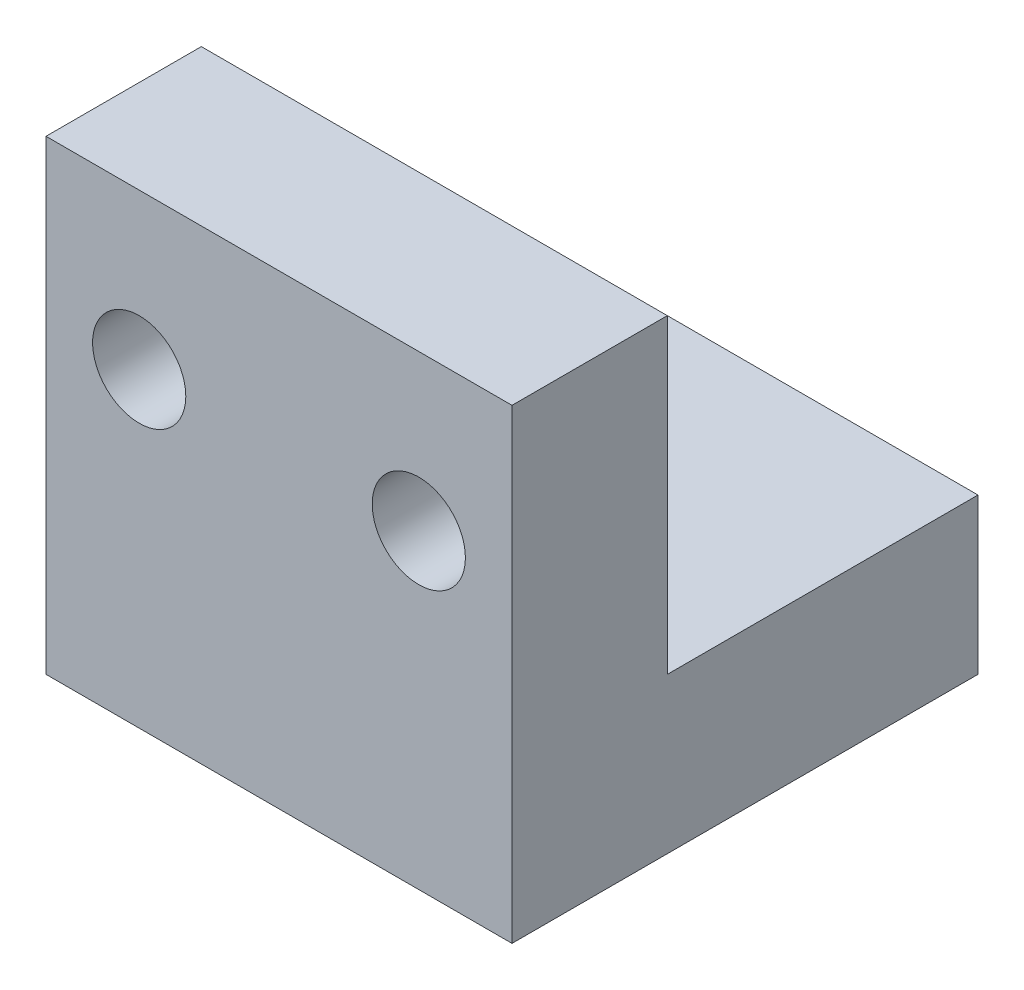
ISO-10303-21;
HEADER;
FILE_DESCRIPTION(('STEP AP214'),'2;1');
FILE_NAME('part.step','',(''),(''),'','','');
FILE_SCHEMA(('AUTOMOTIVE_DESIGN { 1 0 10303 214 1 1 1 1 }'));
ENDSEC;
DATA;
#1=APPLICATION_CONTEXT('core data for automotive mechanical design processes');
#2=APPLICATION_PROTOCOL_DEFINITION('international standard','automotive_design',2000,#1);
#3=PRODUCT_CONTEXT('',#1,'mechanical');
#4=PRODUCT('Part','Part','',(#3));
#5=PRODUCT_RELATED_PRODUCT_CATEGORY('part','',(#4));
#6=PRODUCT_DEFINITION_FORMATION('','',#4);
#7=PRODUCT_DEFINITION_CONTEXT('part definition',#1,'design');
#8=PRODUCT_DEFINITION('design','',#6,#7);
#9=PRODUCT_DEFINITION_SHAPE('','',#8);
#10=(LENGTH_UNIT() NAMED_UNIT(*) SI_UNIT(.MILLI.,.METRE.));
#11=(NAMED_UNIT(*) PLANE_ANGLE_UNIT() SI_UNIT($,.RADIAN.));
#12=(NAMED_UNIT(*) SI_UNIT($,.STERADIAN.) SOLID_ANGLE_UNIT());
#13=UNCERTAINTY_MEASURE_WITH_UNIT(LENGTH_MEASURE(1.E-05),#10,'distance_accuracy_value','');
#14=(GEOMETRIC_REPRESENTATION_CONTEXT(3) GLOBAL_UNCERTAINTY_ASSIGNED_CONTEXT((#13)) GLOBAL_UNIT_ASSIGNED_CONTEXT((#10,
#11,#12)) REPRESENTATION_CONTEXT('',''));
#15=CARTESIAN_POINT('',(0.,0.,0.));
#16=DIRECTION('',(0.,0.,1.));
#17=DIRECTION('',(1.,0.,0.));
#18=AXIS2_PLACEMENT_3D('',#15,#16,#17);
#19=CARTESIAN_POINT('',(0.,5.,0.));
#20=DIRECTION('',(0.,-1.,0.));
#21=DIRECTION('',(0.,0.,-1.));
#22=AXIS2_PLACEMENT_3D('',#19,#20,#21);
#23=PLANE('',#22);
#24=DIRECTION('',(0.,0.,1.));
#25=VECTOR('',#24,1.);
#26=CARTESIAN_POINT('',(0.,5.,0.));
#27=LINE('',#26,#25);
#28=CARTESIAN_POINT('',(0.,5.,-15.));
#29=VERTEX_POINT('',#28);
#30=CARTESIAN_POINT('',(0.,5.,-5.));
#31=VERTEX_POINT('',#30);
#32=EDGE_CURVE('E97',#29,#31,#27,.T.);
#33=ORIENTED_EDGE('',*,*,#32,.T.);
#34=DIRECTION('',(1.,0.,0.));
#35=VECTOR('',#34,1.);
#36=CARTESIAN_POINT('',(0.,5.,-5.));
#37=LINE('',#36,#35);
#38=CARTESIAN_POINT('',(15.,5.,-5.));
#39=VERTEX_POINT('',#38);
#40=EDGE_CURVE('E11',#31,#39,#37,.T.);
#41=ORIENTED_EDGE('',*,*,#40,.T.);
#42=DIRECTION('',(0.,0.,-1.));
#43=VECTOR('',#42,1.);
#44=CARTESIAN_POINT('',(15.,5.,0.));
#45=LINE('',#44,#43);
#46=CARTESIAN_POINT('',(15.,5.,-15.));
#47=VERTEX_POINT('',#46);
#48=EDGE_CURVE('E170',#39,#47,#45,.T.);
#49=ORIENTED_EDGE('',*,*,#48,.T.);
#50=DIRECTION('',(-1.,0.,0.));
#51=VECTOR('',#50,1.);
#52=CARTESIAN_POINT('',(0.,5.,-15.));
#53=LINE('',#52,#51);
#54=EDGE_CURVE('E68',#47,#29,#53,.T.);
#55=ORIENTED_EDGE('',*,*,#54,.T.);
#56=EDGE_LOOP('',(#33,#41,#49,#55));
#57=FACE_BOUND('',#56,.T.);
#58=CARTESIAN_POINT('',(7.5,5.,-10.));
#59=DIRECTION('',(0.,1.,0.));
#60=DIRECTION('',(0.,0.,1.));
#61=AXIS2_PLACEMENT_3D('',#58,#59,#60);
#62=CIRCLE('',#61,1.5);
#63=CARTESIAN_POINT('',(7.5,5.,-8.5));
#64=VERTEX_POINT('',#63);
#65=EDGE_CURVE('E111',#64,#64,#62,.T.);
#66=ORIENTED_EDGE('',*,*,#65,.F.);
#67=EDGE_LOOP('',(#66));
#68=FACE_BOUND('',#67,.T.);
#69=ADVANCED_FACE('F44',(#57,#68),#23,.F.);
#70=CARTESIAN_POINT('',(0.,0.,0.));
#71=DIRECTION('',(0.,-1.,0.));
#72=DIRECTION('',(0.,0.,-1.));
#73=AXIS2_PLACEMENT_3D('',#70,#71,#72);
#74=PLANE('',#73);
#75=DIRECTION('',(-1.,0.,0.));
#76=VECTOR('',#75,1.);
#77=CARTESIAN_POINT('',(0.,0.,-15.));
#78=LINE('',#77,#76);
#79=CARTESIAN_POINT('',(15.,0.,-15.));
#80=VERTEX_POINT('',#79);
#81=CARTESIAN_POINT('',(0.,0.,-15.));
#82=VERTEX_POINT('',#81);
#83=EDGE_CURVE('E86',#80,#82,#78,.T.);
#84=ORIENTED_EDGE('',*,*,#83,.F.);
#85=DIRECTION('',(0.,0.,-1.));
#86=VECTOR('',#85,1.);
#87=CARTESIAN_POINT('',(15.,0.,0.));
#88=LINE('',#87,#86);
#89=CARTESIAN_POINT('',(15.,0.,0.));
#90=VERTEX_POINT('',#89);
#91=EDGE_CURVE('E99',#90,#80,#88,.T.);
#92=ORIENTED_EDGE('',*,*,#91,.F.);
#93=DIRECTION('',(1.,0.,0.));
#94=VECTOR('',#93,1.);
#95=CARTESIAN_POINT('',(0.,0.,0.));
#96=LINE('',#95,#94);
#97=CARTESIAN_POINT('',(0.,0.,0.));
#98=VERTEX_POINT('',#97);
#99=EDGE_CURVE('E112',#98,#90,#96,.T.);
#100=ORIENTED_EDGE('',*,*,#99,.F.);
#101=DIRECTION('',(0.,0.,1.));
#102=VECTOR('',#101,1.);
#103=CARTESIAN_POINT('',(0.,0.,0.));
#104=LINE('',#103,#102);
#105=EDGE_CURVE('E102',#82,#98,#104,.T.);
#106=ORIENTED_EDGE('',*,*,#105,.F.);
#107=EDGE_LOOP('',(#84,#92,#100,#106));
#108=FACE_BOUND('',#107,.T.);
#109=CARTESIAN_POINT('',(7.5,0.,-10.));
#110=DIRECTION('',(0.,1.,0.));
#111=DIRECTION('',(0.,0.,1.));
#112=AXIS2_PLACEMENT_3D('',#109,#110,#111);
#113=CIRCLE('',#112,1.5);
#114=CARTESIAN_POINT('',(7.5,0.,-8.5));
#115=VERTEX_POINT('',#114);
#116=EDGE_CURVE('E118',#115,#115,#113,.T.);
#117=ORIENTED_EDGE('',*,*,#116,.T.);
#118=EDGE_LOOP('',(#117));
#119=FACE_BOUND('',#118,.T.);
#120=ADVANCED_FACE('F108',(#108,#119),#74,.T.);
#121=CARTESIAN_POINT('',(0.,5.,0.));
#122=DIRECTION('',(1.,0.,0.));
#123=DIRECTION('',(0.,0.,-1.));
#124=AXIS2_PLACEMENT_3D('',#121,#122,#123);
#125=PLANE('',#124);
#126=DIRECTION('',(0.,-1.,0.));
#127=VECTOR('',#126,1.);
#128=CARTESIAN_POINT('',(0.,5.,0.));
#129=LINE('',#128,#127);
#130=CARTESIAN_POINT('',(0.,15.,0.));
#131=VERTEX_POINT('',#130);
#132=EDGE_CURVE('E53',#131,#98,#129,.T.);
#133=ORIENTED_EDGE('',*,*,#132,.F.);
#134=DIRECTION('',(0.,0.,1.));
#135=VECTOR('',#134,1.);
#136=CARTESIAN_POINT('',(0.,15.,-5.));
#137=LINE('',#136,#135);
#138=CARTESIAN_POINT('',(0.,15.,-5.));
#139=VERTEX_POINT('',#138);
#140=EDGE_CURVE('E145',#139,#131,#137,.T.);
#141=ORIENTED_EDGE('',*,*,#140,.F.);
#142=DIRECTION('',(0.,-1.,0.));
#143=VECTOR('',#142,1.);
#144=CARTESIAN_POINT('',(0.,0.,-5.));
#145=LINE('',#144,#143);
#146=EDGE_CURVE('E179',#139,#31,#145,.T.);
#147=ORIENTED_EDGE('',*,*,#146,.T.);
#148=ORIENTED_EDGE('',*,*,#32,.F.);
#149=DIRECTION('',(0.,-1.,0.));
#150=VECTOR('',#149,1.);
#151=CARTESIAN_POINT('',(0.,5.,-15.));
#152=LINE('',#151,#150);
#153=EDGE_CURVE('E93',#29,#82,#152,.T.);
#154=ORIENTED_EDGE('',*,*,#153,.T.);
#155=ORIENTED_EDGE('',*,*,#105,.T.);
#156=EDGE_LOOP('',(#133,#141,#147,#148,#154,#155));
#157=FACE_BOUND('',#156,.T.);
#158=ADVANCED_FACE('F50',(#157),#125,.F.);
#159=CARTESIAN_POINT('',(0.,5.,0.));
#160=DIRECTION('',(0.,0.,-1.));
#161=DIRECTION('',(-1.,0.,0.));
#162=AXIS2_PLACEMENT_3D('',#159,#160,#161);
#163=PLANE('',#162);
#164=ORIENTED_EDGE('',*,*,#99,.T.);
#165=DIRECTION('',(0.,-1.,0.));
#166=VECTOR('',#165,1.);
#167=CARTESIAN_POINT('',(15.,5.,0.));
#168=LINE('',#167,#166);
#169=CARTESIAN_POINT('',(15.,15.,0.));
#170=VERTEX_POINT('',#169);
#171=EDGE_CURVE('E129',#170,#90,#168,.T.);
#172=ORIENTED_EDGE('',*,*,#171,.F.);
#173=DIRECTION('',(-1.,0.,0.));
#174=VECTOR('',#173,1.);
#175=CARTESIAN_POINT('',(0.,15.,0.));
#176=LINE('',#175,#174);
#177=EDGE_CURVE('E140',#170,#131,#176,.T.);
#178=ORIENTED_EDGE('',*,*,#177,.T.);
#179=ORIENTED_EDGE('',*,*,#132,.T.);
#180=EDGE_LOOP('',(#164,#172,#178,#179));
#181=FACE_BOUND('',#180,.T.);
#182=CARTESIAN_POINT('',(12.,10.,0.));
#183=DIRECTION('',(0.,0.,1.));
#184=DIRECTION('',(1.,0.,0.));
#185=AXIS2_PLACEMENT_3D('',#182,#183,#184);
#186=CIRCLE('',#185,1.5);
#187=CARTESIAN_POINT('',(13.5,10.,0.));
#188=VERTEX_POINT('',#187);
#189=EDGE_CURVE('E193',#188,#188,#186,.T.);
#190=ORIENTED_EDGE('',*,*,#189,.F.);
#191=EDGE_LOOP('',(#190));
#192=FACE_BOUND('',#191,.T.);
#193=CARTESIAN_POINT('',(3.,10.,0.));
#194=DIRECTION('',(0.,0.,1.));
#195=DIRECTION('',(1.,0.,0.));
#196=AXIS2_PLACEMENT_3D('',#193,#194,#195);
#197=CIRCLE('',#196,1.5);
#198=CARTESIAN_POINT('',(4.5,10.,0.));
#199=VERTEX_POINT('',#198);
#200=EDGE_CURVE('E183',#199,#199,#197,.T.);
#201=ORIENTED_EDGE('',*,*,#200,.F.);
#202=EDGE_LOOP('',(#201));
#203=FACE_BOUND('',#202,.T.);
#204=ADVANCED_FACE('F133',(#181,#192,#203),#163,.F.);
#205=CARTESIAN_POINT('',(15.,5.,0.));
#206=DIRECTION('',(-1.,0.,0.));
#207=DIRECTION('',(0.,0.,1.));
#208=AXIS2_PLACEMENT_3D('',#205,#206,#207);
#209=PLANE('',#208);
#210=ORIENTED_EDGE('',*,*,#91,.T.);
#211=DIRECTION('',(0.,-1.,0.));
#212=VECTOR('',#211,1.);
#213=CARTESIAN_POINT('',(15.,5.,-15.));
#214=LINE('',#213,#212);
#215=EDGE_CURVE('E94',#47,#80,#214,.T.);
#216=ORIENTED_EDGE('',*,*,#215,.F.);
#217=ORIENTED_EDGE('',*,*,#48,.F.);
#218=DIRECTION('',(0.,1.,0.));
#219=VECTOR('',#218,1.);
#220=CARTESIAN_POINT('',(15.,0.,-5.));
#221=LINE('',#220,#219);
#222=CARTESIAN_POINT('',(15.,15.,-5.));
#223=VERTEX_POINT('',#222);
#224=EDGE_CURVE('E62',#39,#223,#221,.T.);
#225=ORIENTED_EDGE('',*,*,#224,.T.);
#226=DIRECTION('',(0.,0.,1.));
#227=VECTOR('',#226,1.);
#228=CARTESIAN_POINT('',(15.,15.,-5.));
#229=LINE('',#228,#227);
#230=EDGE_CURVE('E154',#223,#170,#229,.T.);
#231=ORIENTED_EDGE('',*,*,#230,.T.);
#232=ORIENTED_EDGE('',*,*,#171,.T.);
#233=EDGE_LOOP('',(#210,#216,#217,#225,#231,#232));
#234=FACE_BOUND('',#233,.T.);
#235=ADVANCED_FACE('F174',(#234),#209,.F.);
#236=CARTESIAN_POINT('',(0.,5.,-15.));
#237=DIRECTION('',(0.,0.,1.));
#238=DIRECTION('',(1.,0.,0.));
#239=AXIS2_PLACEMENT_3D('',#236,#237,#238);
#240=PLANE('',#239);
#241=ORIENTED_EDGE('',*,*,#83,.T.);
#242=ORIENTED_EDGE('',*,*,#153,.F.);
#243=ORIENTED_EDGE('',*,*,#54,.F.);
#244=ORIENTED_EDGE('',*,*,#215,.T.);
#245=EDGE_LOOP('',(#241,#242,#243,#244));
#246=FACE_BOUND('',#245,.T.);
#247=ADVANCED_FACE('F89',(#246),#240,.F.);
#248=CARTESIAN_POINT('',(7.5,5.,-10.));
#249=DIRECTION('',(0.,-1.,0.));
#250=DIRECTION('',(0.,0.,-1.));
#251=AXIS2_PLACEMENT_3D('',#248,#249,#250);
#252=CYLINDRICAL_SURFACE('',#251,1.5);
#253=ORIENTED_EDGE('',*,*,#65,.T.);
#254=EDGE_LOOP('',(#253));
#255=FACE_BOUND('',#254,.T.);
#256=ORIENTED_EDGE('',*,*,#116,.F.);
#257=EDGE_LOOP('',(#256));
#258=FACE_BOUND('',#257,.T.);
#259=ADVANCED_FACE('F228',(#255,#258),#252,.F.);
#260=CARTESIAN_POINT('',(0.,0.,-5.));
#261=DIRECTION('',(0.,0.,-1.));
#262=DIRECTION('',(-1.,0.,0.));
#263=AXIS2_PLACEMENT_3D('',#260,#261,#262);
#264=PLANE('',#263);
#265=CARTESIAN_POINT('',(3.,10.,-5.));
#266=DIRECTION('',(0.,0.,1.));
#267=DIRECTION('',(1.,0.,0.));
#268=AXIS2_PLACEMENT_3D('',#265,#266,#267);
#269=CIRCLE('',#268,1.5);
#270=CARTESIAN_POINT('',(4.5,10.,-5.));
#271=VERTEX_POINT('',#270);
#272=EDGE_CURVE('E186',#271,#271,#269,.T.);
#273=ORIENTED_EDGE('',*,*,#272,.T.);
#274=EDGE_LOOP('',(#273));
#275=FACE_BOUND('',#274,.T.);
#276=CARTESIAN_POINT('',(12.,10.,-5.));
#277=DIRECTION('',(0.,0.,1.));
#278=DIRECTION('',(1.,0.,0.));
#279=AXIS2_PLACEMENT_3D('',#276,#277,#278);
#280=CIRCLE('',#279,1.5);
#281=CARTESIAN_POINT('',(13.5,10.,-5.));
#282=VERTEX_POINT('',#281);
#283=EDGE_CURVE('E188',#282,#282,#280,.T.);
#284=ORIENTED_EDGE('',*,*,#283,.T.);
#285=EDGE_LOOP('',(#284));
#286=FACE_BOUND('',#285,.T.);
#287=ORIENTED_EDGE('',*,*,#40,.F.);
#288=ORIENTED_EDGE('',*,*,#146,.F.);
#289=DIRECTION('',(-1.,0.,0.));
#290=VECTOR('',#289,1.);
#291=CARTESIAN_POINT('',(0.,15.,-5.));
#292=LINE('',#291,#290);
#293=EDGE_CURVE('E153',#223,#139,#292,.T.);
#294=ORIENTED_EDGE('',*,*,#293,.F.);
#295=ORIENTED_EDGE('',*,*,#224,.F.);
#296=EDGE_LOOP('',(#287,#288,#294,#295));
#297=FACE_BOUND('',#296,.T.);
#298=ADVANCED_FACE('F180',(#275,#286,#297),#264,.T.);
#299=CARTESIAN_POINT('',(0.,15.,-5.));
#300=DIRECTION('',(0.,1.,0.));
#301=DIRECTION('',(0.,0.,1.));
#302=AXIS2_PLACEMENT_3D('',#299,#300,#301);
#303=PLANE('',#302);
#304=ORIENTED_EDGE('',*,*,#177,.F.);
#305=ORIENTED_EDGE('',*,*,#230,.F.);
#306=ORIENTED_EDGE('',*,*,#293,.T.);
#307=ORIENTED_EDGE('',*,*,#140,.T.);
#308=EDGE_LOOP('',(#304,#305,#306,#307));
#309=FACE_BOUND('',#308,.T.);
#310=ADVANCED_FACE('F151',(#309),#303,.T.);
#311=CARTESIAN_POINT('',(3.,10.,-5.));
#312=DIRECTION('',(0.,0.,1.));
#313=DIRECTION('',(1.,0.,0.));
#314=AXIS2_PLACEMENT_3D('',#311,#312,#313);
#315=CYLINDRICAL_SURFACE('',#314,1.5);
#316=ORIENTED_EDGE('',*,*,#272,.F.);
#317=EDGE_LOOP('',(#316));
#318=FACE_BOUND('',#317,.T.);
#319=ORIENTED_EDGE('',*,*,#200,.T.);
#320=EDGE_LOOP('',(#319));
#321=FACE_BOUND('',#320,.T.);
#322=ADVANCED_FACE('F206',(#318,#321),#315,.F.);
#323=CARTESIAN_POINT('',(12.,10.,-5.));
#324=DIRECTION('',(0.,0.,1.));
#325=DIRECTION('',(1.,0.,0.));
#326=AXIS2_PLACEMENT_3D('',#323,#324,#325);
#327=CYLINDRICAL_SURFACE('',#326,1.5);
#328=ORIENTED_EDGE('',*,*,#283,.F.);
#329=EDGE_LOOP('',(#328));
#330=FACE_BOUND('',#329,.T.);
#331=ORIENTED_EDGE('',*,*,#189,.T.);
#332=EDGE_LOOP('',(#331));
#333=FACE_BOUND('',#332,.T.);
#334=ADVANCED_FACE('F201',(#330,#333),#327,.F.);
#335=CLOSED_SHELL('',(#69,#120,#158,#204,#235,#247,#259,#298,#310,#322,#334));
#336=MANIFOLD_SOLID_BREP('B2',#335);
#337=ADVANCED_BREP_SHAPE_REPRESENTATION('',(#18,#336),#14);
#338=SHAPE_DEFINITION_REPRESENTATION(#9,#337);
ENDSEC;
END-ISO-10303-21;
